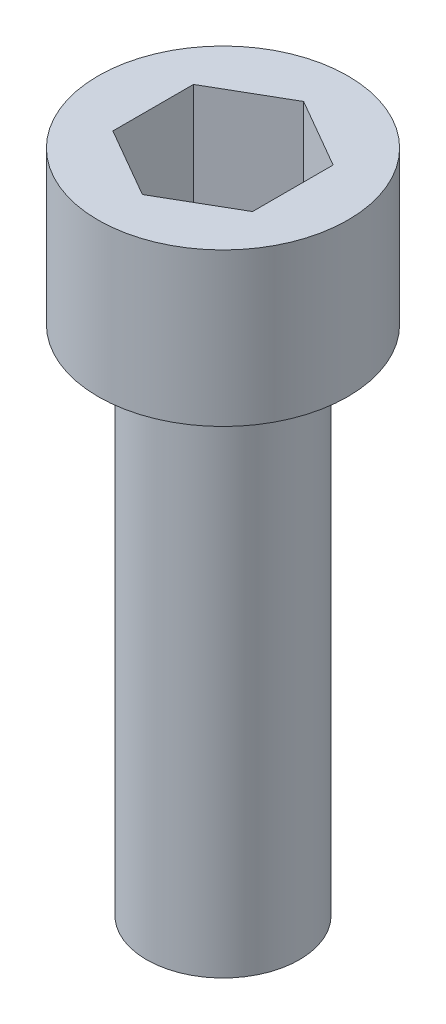
ISO-10303-21;
HEADER;
FILE_DESCRIPTION(('STEP AP214'),'2;1');
FILE_NAME('part.step','',(''),(''),'','','');
FILE_SCHEMA(('AUTOMOTIVE_DESIGN { 1 0 10303 214 1 1 1 1 }'));
ENDSEC;
DATA;
#1=APPLICATION_CONTEXT('core data for automotive mechanical design processes');
#2=APPLICATION_PROTOCOL_DEFINITION('international standard','automotive_design',2000,#1);
#3=PRODUCT_CONTEXT('',#1,'mechanical');
#4=PRODUCT('Part','Part','',(#3));
#5=PRODUCT_RELATED_PRODUCT_CATEGORY('part','',(#4));
#6=PRODUCT_DEFINITION_FORMATION('','',#4);
#7=PRODUCT_DEFINITION_CONTEXT('part definition',#1,'design');
#8=PRODUCT_DEFINITION('design','',#6,#7);
#9=PRODUCT_DEFINITION_SHAPE('','',#8);
#10=(LENGTH_UNIT() NAMED_UNIT(*) SI_UNIT(.MILLI.,.METRE.));
#11=(NAMED_UNIT(*) PLANE_ANGLE_UNIT() SI_UNIT($,.RADIAN.));
#12=(NAMED_UNIT(*) SI_UNIT($,.STERADIAN.) SOLID_ANGLE_UNIT());
#13=UNCERTAINTY_MEASURE_WITH_UNIT(LENGTH_MEASURE(1.E-05),#10,'distance_accuracy_value','');
#14=(GEOMETRIC_REPRESENTATION_CONTEXT(3) GLOBAL_UNCERTAINTY_ASSIGNED_CONTEXT((#13)) GLOBAL_UNIT_ASSIGNED_CONTEXT((#10,
#11,#12)) REPRESENTATION_CONTEXT('',''));
#15=CARTESIAN_POINT('',(0.,0.,0.));
#16=DIRECTION('',(0.,0.,1.));
#17=DIRECTION('',(1.,0.,0.));
#18=AXIS2_PLACEMENT_3D('',#15,#16,#17);
#19=CARTESIAN_POINT('',(0.,2.8448,0.));
#20=DIRECTION('',(0.,-1.,0.));
#21=DIRECTION('',(0.,0.,-1.));
#22=AXIS2_PLACEMENT_3D('',#19,#20,#21);
#23=CYLINDRICAL_SURFACE('',#22,2.3241);
#24=CARTESIAN_POINT('',(0.,2.8448,0.));
#25=DIRECTION('',(0.,1.,0.));
#26=DIRECTION('',(0.,0.,1.));
#27=AXIS2_PLACEMENT_3D('',#24,#25,#26);
#28=CIRCLE('',#27,2.3241);
#29=CARTESIAN_POINT('',(0.,2.8448,2.3241));
#30=VERTEX_POINT('',#29);
#31=EDGE_CURVE('E45',#30,#30,#28,.T.);
#32=ORIENTED_EDGE('',*,*,#31,.F.);
#33=EDGE_LOOP('',(#32));
#34=FACE_BOUND('',#33,.T.);
#35=CARTESIAN_POINT('',(0.,0.,0.));
#36=DIRECTION('',(0.,1.,0.));
#37=DIRECTION('',(0.,0.,1.));
#38=AXIS2_PLACEMENT_3D('',#35,#36,#37);
#39=CIRCLE('',#38,2.3241);
#40=CARTESIAN_POINT('',(0.,0.,2.3241));
#41=VERTEX_POINT('',#40);
#42=EDGE_CURVE('E40',#41,#41,#39,.T.);
#43=ORIENTED_EDGE('',*,*,#42,.T.);
#44=EDGE_LOOP('',(#43));
#45=FACE_BOUND('',#44,.T.);
#46=ADVANCED_FACE('F37',(#34,#45),#23,.T.);
#47=CARTESIAN_POINT('',(0.,2.8448,0.));
#48=DIRECTION('',(0.,1.,0.));
#49=DIRECTION('',(0.,0.,1.));
#50=AXIS2_PLACEMENT_3D('',#47,#48,#49);
#51=PLANE('',#50);
#52=DIRECTION('',(-0.866025403784439,0.,0.5));
#53=VECTOR('',#52,1.);
#54=CARTESIAN_POINT('',(0.,2.8448,-1.5));
#55=LINE('',#54,#53);
#56=CARTESIAN_POINT('',(0.,2.8448,-1.5));
#57=VERTEX_POINT('',#56);
#58=CARTESIAN_POINT('',(-1.29903810567666,2.8448,-0.750000000000012));
#59=VERTEX_POINT('',#58);
#60=EDGE_CURVE('E53',#57,#59,#55,.T.);
#61=ORIENTED_EDGE('',*,*,#60,.F.);
#62=DIRECTION('',(-0.866025403784448,0.,-0.499999999999984));
#63=VECTOR('',#62,1.);
#64=CARTESIAN_POINT('',(1.29903810567664,2.8448,-0.750000000000024));
#65=LINE('',#64,#63);
#66=CARTESIAN_POINT('',(1.29903810567664,2.8448,-0.750000000000024));
#67=VERTEX_POINT('',#66);
#68=EDGE_CURVE('E137',#67,#57,#65,.T.);
#69=ORIENTED_EDGE('',*,*,#68,.F.);
#70=DIRECTION('',(0.,0.,-1.));
#71=VECTOR('',#70,1.);
#72=CARTESIAN_POINT('',(1.29903810567667,2.8448,0.749999999999976));
#73=LINE('',#72,#71);
#74=CARTESIAN_POINT('',(1.29903810567667,2.8448,0.749999999999976));
#75=VERTEX_POINT('',#74);
#76=EDGE_CURVE('E135',#75,#67,#73,.T.);
#77=ORIENTED_EDGE('',*,*,#76,.F.);
#78=DIRECTION('',(0.866025403784439,0.,-0.5));
#79=VECTOR('',#78,1.);
#80=CARTESIAN_POINT('',(0.,2.8448,1.49999999999999));
#81=LINE('',#80,#79);
#82=CARTESIAN_POINT('',(0.,2.8448,1.49999999999999));
#83=VERTEX_POINT('',#82);
#84=EDGE_CURVE('E101',#83,#75,#81,.T.);
#85=ORIENTED_EDGE('',*,*,#84,.F.);
#86=DIRECTION('',(0.866025403784439,0.,0.5));
#87=VECTOR('',#86,1.);
#88=CARTESIAN_POINT('',(-1.29903810567666,2.8448,0.749999999999988));
#89=LINE('',#88,#87);
#90=CARTESIAN_POINT('',(-1.29903810567666,2.8448,0.749999999999988));
#91=VERTEX_POINT('',#90);
#92=EDGE_CURVE('E131',#91,#83,#89,.T.);
#93=ORIENTED_EDGE('',*,*,#92,.F.);
#94=DIRECTION('',(0.,0.,1.));
#95=VECTOR('',#94,1.);
#96=CARTESIAN_POINT('',(-1.29903810567666,2.8448,-0.750000000000012));
#97=LINE('',#96,#95);
#98=EDGE_CURVE('E127',#59,#91,#97,.T.);
#99=ORIENTED_EDGE('',*,*,#98,.F.);
#100=EDGE_LOOP('',(#61,#69,#77,#85,#93,#99));
#101=FACE_BOUND('',#100,.T.);
#102=ORIENTED_EDGE('',*,*,#31,.T.);
#103=EDGE_LOOP('',(#102));
#104=FACE_BOUND('',#103,.T.);
#105=ADVANCED_FACE('F155',(#101,#104),#51,.T.);
#106=CARTESIAN_POINT('',(0.,0.,0.));
#107=DIRECTION('',(0.,1.,0.));
#108=DIRECTION('',(0.,0.,1.));
#109=AXIS2_PLACEMENT_3D('',#106,#107,#108);
#110=PLANE('',#109);
#111=CARTESIAN_POINT('',(0.,0.,0.));
#112=DIRECTION('',(0.,-1.,0.));
#113=DIRECTION('',(0.,0.,-1.));
#114=AXIS2_PLACEMENT_3D('',#111,#112,#113);
#115=CIRCLE('',#114,1.4224);
#116=CARTESIAN_POINT('',(0.,0.,1.4224));
#117=VERTEX_POINT('',#116);
#118=EDGE_CURVE('E11',#117,#117,#115,.T.);
#119=ORIENTED_EDGE('',*,*,#118,.F.);
#120=EDGE_LOOP('',(#119));
#121=FACE_BOUND('',#120,.T.);
#122=ORIENTED_EDGE('',*,*,#42,.F.);
#123=EDGE_LOOP('',(#122));
#124=FACE_BOUND('',#123,.T.);
#125=ADVANCED_FACE('F152',(#121,#124),#110,.F.);
#126=CARTESIAN_POINT('',(0.,0.8448,-1.5));
#127=DIRECTION('',(-0.5,0.,-0.866025403784439));
#128=DIRECTION('',(-0.866025403784439,0.,0.5));
#129=AXIS2_PLACEMENT_3D('',#126,#127,#128);
#130=PLANE('',#129);
#131=ORIENTED_EDGE('',*,*,#60,.T.);
#132=DIRECTION('',(0.,1.,0.));
#133=VECTOR('',#132,1.);
#134=CARTESIAN_POINT('',(-1.29903810567666,0.8448,-0.750000000000012));
#135=LINE('',#134,#133);
#136=CARTESIAN_POINT('',(-1.29903810567666,0.8448,-0.750000000000012));
#137=VERTEX_POINT('',#136);
#138=EDGE_CURVE('E83',#137,#59,#135,.T.);
#139=ORIENTED_EDGE('',*,*,#138,.F.);
#140=DIRECTION('',(-0.866025403784439,0.,0.5));
#141=VECTOR('',#140,1.);
#142=CARTESIAN_POINT('',(0.,0.8448,-1.5));
#143=LINE('',#142,#141);
#144=CARTESIAN_POINT('',(0.,0.8448,-1.5));
#145=VERTEX_POINT('',#144);
#146=EDGE_CURVE('E139',#145,#137,#143,.T.);
#147=ORIENTED_EDGE('',*,*,#146,.F.);
#148=DIRECTION('',(0.,1.,0.));
#149=VECTOR('',#148,1.);
#150=CARTESIAN_POINT('',(0.,0.8448,-1.5));
#151=LINE('',#150,#149);
#152=EDGE_CURVE('E61',#145,#57,#151,.T.);
#153=ORIENTED_EDGE('',*,*,#152,.T.);
#154=EDGE_LOOP('',(#131,#139,#147,#153));
#155=FACE_BOUND('',#154,.T.);
#156=ADVANCED_FACE('F154',(#155),#130,.F.);
#157=CARTESIAN_POINT('',(1.29903810567664,0.8448,-0.750000000000024));
#158=DIRECTION('',(0.499999999999984,0.,-0.866025403784448));
#159=DIRECTION('',(-0.866025403784448,0.,-0.499999999999984));
#160=AXIS2_PLACEMENT_3D('',#157,#158,#159);
#161=PLANE('',#160);
#162=ORIENTED_EDGE('',*,*,#68,.T.);
#163=ORIENTED_EDGE('',*,*,#152,.F.);
#164=DIRECTION('',(-0.866025403784448,0.,-0.499999999999984));
#165=VECTOR('',#164,1.);
#166=CARTESIAN_POINT('',(1.29903810567664,0.8448,-0.750000000000024));
#167=LINE('',#166,#165);
#168=CARTESIAN_POINT('',(1.29903810567664,0.8448,-0.750000000000024));
#169=VERTEX_POINT('',#168);
#170=EDGE_CURVE('E113',#169,#145,#167,.T.);
#171=ORIENTED_EDGE('',*,*,#170,.F.);
#172=DIRECTION('',(0.,1.,0.));
#173=VECTOR('',#172,1.);
#174=CARTESIAN_POINT('',(1.29903810567664,0.8448,-0.750000000000024));
#175=LINE('',#174,#173);
#176=EDGE_CURVE('E105',#169,#67,#175,.T.);
#177=ORIENTED_EDGE('',*,*,#176,.T.);
#178=EDGE_LOOP('',(#162,#163,#171,#177));
#179=FACE_BOUND('',#178,.T.);
#180=ADVANCED_FACE('F161',(#179),#161,.F.);
#181=CARTESIAN_POINT('',(1.29903810567667,0.8448,0.749999999999976));
#182=DIRECTION('',(1.,0.,0.));
#183=DIRECTION('',(0.,0.,-1.));
#184=AXIS2_PLACEMENT_3D('',#181,#182,#183);
#185=PLANE('',#184);
#186=ORIENTED_EDGE('',*,*,#76,.T.);
#187=ORIENTED_EDGE('',*,*,#176,.F.);
#188=DIRECTION('',(0.,0.,-1.));
#189=VECTOR('',#188,1.);
#190=CARTESIAN_POINT('',(1.29903810567667,0.8448,0.749999999999976));
#191=LINE('',#190,#189);
#192=CARTESIAN_POINT('',(1.29903810567667,0.8448,0.749999999999976));
#193=VERTEX_POINT('',#192);
#194=EDGE_CURVE('E109',#193,#169,#191,.T.);
#195=ORIENTED_EDGE('',*,*,#194,.F.);
#196=DIRECTION('',(0.,1.,0.));
#197=VECTOR('',#196,1.);
#198=CARTESIAN_POINT('',(1.29903810567667,0.8448,0.749999999999976));
#199=LINE('',#198,#197);
#200=EDGE_CURVE('E94',#193,#75,#199,.T.);
#201=ORIENTED_EDGE('',*,*,#200,.T.);
#202=EDGE_LOOP('',(#186,#187,#195,#201));
#203=FACE_BOUND('',#202,.T.);
#204=ADVANCED_FACE('F110',(#203),#185,.F.);
#205=CARTESIAN_POINT('',(0.,0.8448,1.49999999999999));
#206=DIRECTION('',(0.5,0.,0.866025403784439));
#207=DIRECTION('',(0.866025403784439,0.,-0.5));
#208=AXIS2_PLACEMENT_3D('',#205,#206,#207);
#209=PLANE('',#208);
#210=ORIENTED_EDGE('',*,*,#84,.T.);
#211=ORIENTED_EDGE('',*,*,#200,.F.);
#212=DIRECTION('',(0.866025403784439,0.,-0.5));
#213=VECTOR('',#212,1.);
#214=CARTESIAN_POINT('',(0.,0.8448,1.49999999999999));
#215=LINE('',#214,#213);
#216=CARTESIAN_POINT('',(0.,0.8448,1.49999999999999));
#217=VERTEX_POINT('',#216);
#218=EDGE_CURVE('E98',#217,#193,#215,.T.);
#219=ORIENTED_EDGE('',*,*,#218,.F.);
#220=DIRECTION('',(0.,1.,0.));
#221=VECTOR('',#220,1.);
#222=CARTESIAN_POINT('',(0.,0.8448,1.49999999999999));
#223=LINE('',#222,#221);
#224=EDGE_CURVE('E106',#217,#83,#223,.T.);
#225=ORIENTED_EDGE('',*,*,#224,.T.);
#226=EDGE_LOOP('',(#210,#211,#219,#225));
#227=FACE_BOUND('',#226,.T.);
#228=ADVANCED_FACE('F96',(#227),#209,.F.);
#229=CARTESIAN_POINT('',(-1.29903810567666,0.8448,0.749999999999988));
#230=DIRECTION('',(-0.5,0.,0.866025403784439));
#231=DIRECTION('',(0.866025403784439,0.,0.5));
#232=AXIS2_PLACEMENT_3D('',#229,#230,#231);
#233=PLANE('',#232);
#234=ORIENTED_EDGE('',*,*,#92,.T.);
#235=ORIENTED_EDGE('',*,*,#224,.F.);
#236=DIRECTION('',(0.866025403784439,0.,0.5));
#237=VECTOR('',#236,1.);
#238=CARTESIAN_POINT('',(-1.29903810567666,0.8448,0.749999999999988));
#239=LINE('',#238,#237);
#240=CARTESIAN_POINT('',(-1.29903810567666,0.8448,0.749999999999988));
#241=VERTEX_POINT('',#240);
#242=EDGE_CURVE('E119',#241,#217,#239,.T.);
#243=ORIENTED_EDGE('',*,*,#242,.F.);
#244=DIRECTION('',(0.,1.,0.));
#245=VECTOR('',#244,1.);
#246=CARTESIAN_POINT('',(-1.29903810567666,0.8448,0.749999999999988));
#247=LINE('',#246,#245);
#248=EDGE_CURVE('E143',#241,#91,#247,.T.);
#249=ORIENTED_EDGE('',*,*,#248,.T.);
#250=EDGE_LOOP('',(#234,#235,#243,#249));
#251=FACE_BOUND('',#250,.T.);
#252=ADVANCED_FACE('F206',(#251),#233,.F.);
#253=CARTESIAN_POINT('',(-1.29903810567666,0.8448,-0.750000000000012));
#254=DIRECTION('',(-1.,0.,0.));
#255=DIRECTION('',(0.,0.,1.));
#256=AXIS2_PLACEMENT_3D('',#253,#254,#255);
#257=PLANE('',#256);
#258=ORIENTED_EDGE('',*,*,#98,.T.);
#259=ORIENTED_EDGE('',*,*,#248,.F.);
#260=DIRECTION('',(0.,0.,1.));
#261=VECTOR('',#260,1.);
#262=CARTESIAN_POINT('',(-1.29903810567666,0.8448,-0.750000000000012));
#263=LINE('',#262,#261);
#264=EDGE_CURVE('E121',#137,#241,#263,.T.);
#265=ORIENTED_EDGE('',*,*,#264,.F.);
#266=ORIENTED_EDGE('',*,*,#138,.T.);
#267=EDGE_LOOP('',(#258,#259,#265,#266));
#268=FACE_BOUND('',#267,.T.);
#269=ADVANCED_FACE('F215',(#268),#257,.F.);
#270=CARTESIAN_POINT('',(0.,0.8448,0.));
#271=DIRECTION('',(0.,1.,0.));
#272=DIRECTION('',(0.,0.,1.));
#273=AXIS2_PLACEMENT_3D('',#270,#271,#272);
#274=PLANE('',#273);
#275=ORIENTED_EDGE('',*,*,#146,.T.);
#276=ORIENTED_EDGE('',*,*,#264,.T.);
#277=ORIENTED_EDGE('',*,*,#242,.T.);
#278=ORIENTED_EDGE('',*,*,#218,.T.);
#279=ORIENTED_EDGE('',*,*,#194,.T.);
#280=ORIENTED_EDGE('',*,*,#170,.T.);
#281=EDGE_LOOP('',(#275,#276,#277,#278,#279,#280));
#282=FACE_BOUND('',#281,.T.);
#283=ADVANCED_FACE('F116',(#282),#274,.T.);
#284=CARTESIAN_POINT('',(0.,-9.525,0.));
#285=DIRECTION('',(0.,1.,0.));
#286=DIRECTION('',(0.,0.,1.));
#287=AXIS2_PLACEMENT_3D('',#284,#285,#286);
#288=CYLINDRICAL_SURFACE('',#287,1.4224);
#289=CARTESIAN_POINT('',(0.,-9.525,0.));
#290=DIRECTION('',(0.,-1.,0.));
#291=DIRECTION('',(0.,0.,-1.));
#292=AXIS2_PLACEMENT_3D('',#289,#290,#291);
#293=CIRCLE('',#292,1.4224);
#294=CARTESIAN_POINT('',(0.,-9.525,1.4224));
#295=VERTEX_POINT('',#294);
#296=EDGE_CURVE('E128',#295,#295,#293,.T.);
#297=CARTESIAN_POINT('',(0.,-9.525,1.4224));
#298=CARTESIAN_POINT('',(0.,-9.42578125,1.4224));
#299=CARTESIAN_POINT('',(0.,-9.3265625,1.4224));
#300=CARTESIAN_POINT('',(0.,-9.128125,1.4224));
#301=CARTESIAN_POINT('',(0.,-9.02890625,1.4224));
#302=CARTESIAN_POINT('',(0.,-8.83046875,1.4224));
#303=CARTESIAN_POINT('',(0.,-8.73125,1.4224));
#304=CARTESIAN_POINT('',(0.,-8.5328125,1.4224));
#305=CARTESIAN_POINT('',(0.,-8.43359375,1.4224));
#306=CARTESIAN_POINT('',(0.,-8.23515625,1.4224));
#307=CARTESIAN_POINT('',(0.,-8.1359375,1.4224));
#308=CARTESIAN_POINT('',(0.,-7.9375,1.4224));
#309=CARTESIAN_POINT('',(0.,-7.83828125,1.4224));
#310=CARTESIAN_POINT('',(0.,-7.63984375,1.4224));
#311=CARTESIAN_POINT('',(0.,-7.540625,1.4224));
#312=CARTESIAN_POINT('',(0.,-7.3421875,1.4224));
#313=CARTESIAN_POINT('',(0.,-7.24296875,1.4224));
#314=CARTESIAN_POINT('',(0.,-7.04453125,1.4224));
#315=CARTESIAN_POINT('',(0.,-6.9453125,1.4224));
#316=CARTESIAN_POINT('',(0.,-6.746875,1.4224));
#317=CARTESIAN_POINT('',(0.,-6.64765625,1.4224));
#318=CARTESIAN_POINT('',(0.,-6.44921875,1.4224));
#319=CARTESIAN_POINT('',(0.,-6.35,1.4224));
#320=CARTESIAN_POINT('',(0.,-6.1515625,1.4224));
#321=CARTESIAN_POINT('',(0.,-6.05234375,1.4224));
#322=CARTESIAN_POINT('',(0.,-5.85390625,1.4224));
#323=CARTESIAN_POINT('',(0.,-5.7546875,1.4224));
#324=CARTESIAN_POINT('',(0.,-5.55625,1.4224));
#325=CARTESIAN_POINT('',(0.,-5.45703125,1.4224));
#326=CARTESIAN_POINT('',(0.,-5.25859375,1.4224));
#327=CARTESIAN_POINT('',(0.,-5.159375,1.4224));
#328=CARTESIAN_POINT('',(0.,-4.9609375,1.4224));
#329=CARTESIAN_POINT('',(0.,-4.86171875,1.4224));
#330=CARTESIAN_POINT('',(0.,-4.66328125,1.4224));
#331=CARTESIAN_POINT('',(0.,-4.5640625,1.4224));
#332=CARTESIAN_POINT('',(0.,-4.365625,1.4224));
#333=CARTESIAN_POINT('',(0.,-4.26640625,1.4224));
#334=CARTESIAN_POINT('',(0.,-4.06796875,1.4224));
#335=CARTESIAN_POINT('',(0.,-3.96875,1.4224));
#336=CARTESIAN_POINT('',(0.,-3.7703125,1.4224));
#337=CARTESIAN_POINT('',(0.,-3.67109375,1.4224));
#338=CARTESIAN_POINT('',(0.,-3.47265625,1.4224));
#339=CARTESIAN_POINT('',(0.,-3.3734375,1.4224));
#340=CARTESIAN_POINT('',(0.,-3.175,1.4224));
#341=CARTESIAN_POINT('',(0.,-3.07578125,1.4224));
#342=CARTESIAN_POINT('',(0.,-2.87734375,1.4224));
#343=CARTESIAN_POINT('',(0.,-2.778125,1.4224));
#344=CARTESIAN_POINT('',(0.,-2.5796875,1.4224));
#345=CARTESIAN_POINT('',(0.,-2.48046875,1.4224));
#346=CARTESIAN_POINT('',(0.,-2.28203125,1.4224));
#347=CARTESIAN_POINT('',(0.,-2.1828125,1.4224));
#348=CARTESIAN_POINT('',(0.,-1.984375,1.4224));
#349=CARTESIAN_POINT('',(0.,-1.88515625,1.4224));
#350=CARTESIAN_POINT('',(0.,-1.68671875,1.4224));
#351=CARTESIAN_POINT('',(0.,-1.5875,1.4224));
#352=CARTESIAN_POINT('',(0.,-1.3890625,1.4224));
#353=CARTESIAN_POINT('',(0.,-1.28984375,1.4224));
#354=CARTESIAN_POINT('',(0.,-1.09140625,1.4224));
#355=CARTESIAN_POINT('',(0.,-0.992187500000001,1.4224));
#356=CARTESIAN_POINT('',(0.,-0.793750000000001,1.4224));
#357=CARTESIAN_POINT('',(0.,-0.69453125,1.4224));
#358=CARTESIAN_POINT('',(0.,-0.49609375,1.4224));
#359=CARTESIAN_POINT('',(0.,-0.396875,1.4224));
#360=CARTESIAN_POINT('',(0.,-0.1984375,1.4224));
#361=CARTESIAN_POINT('',(0.,-0.0992187500000001,1.4224));
#362=CARTESIAN_POINT('',(0.,0.,1.4224));
#363=B_SPLINE_CURVE_WITH_KNOTS('',3,(#297,#298,#299,#300,#301,#302,#303,#304,#305,#306,#307,
#308,#309,#310,#311,#312,#313,#314,#315,#316,#317,#318,#319,#320,#321,#322,#323,#324,#325,#326,
#327,#328,#329,#330,#331,#332,#333,#334,#335,#336,#337,#338,#339,#340,#341,#342,#343,#344,#345,
#346,#347,#348,#349,#350,#351,#352,#353,#354,#355,#356,#357,#358,#359,#360,#361,#362),
.UNSPECIFIED.,.F.,.F.,(4,2,2,2,2,2,2,2,2,2,2,2,2,2,2,2,2,2,2,2,2,2,2,2,2,2,2,2,2,2,2,2,4),(0.,
0.297656249999998,0.595312499999999,0.892968749999999,1.190625,1.48828125,1.7859375,2.08359375,
2.38125,2.67890625,2.9765625,3.27421875,3.571875,3.86953125,4.1671875,4.46484375,4.7625,
5.06015625,5.3578125,5.65546875,5.953125,6.25078125,6.5484375,6.84609375,7.14375,7.44140625,
7.7390625,8.03671875,8.334375,8.63203125,8.9296875,9.22734375,9.525),.UNSPECIFIED.);
#364=EDGE_CURVE('BSEAM233',#295,#117,#363,.T.);
#365=ORIENTED_EDGE('',*,*,#296,.F.);
#366=ORIENTED_EDGE('',*,*,#118,.T.);
#367=ORIENTED_EDGE('',*,*,#364,.T.);
#368=ORIENTED_EDGE('',*,*,#364,.F.);
#369=EDGE_LOOP('',(#365,#367,#366,#368));
#370=FACE_BOUND('',#369,.T.);
#371=ADVANCED_FACE('F233',(#370),#288,.T.);
#372=CARTESIAN_POINT('',(0.,-9.525,0.));
#373=DIRECTION('',(0.,-1.,0.));
#374=DIRECTION('',(0.,0.,-1.));
#375=AXIS2_PLACEMENT_3D('',#372,#373,#374);
#376=PLANE('',#375);
#377=ORIENTED_EDGE('',*,*,#296,.T.);
#378=EDGE_LOOP('',(#377));
#379=FACE_BOUND('',#378,.T.);
#380=ADVANCED_FACE('F246',(#379),#376,.T.);
#381=CLOSED_SHELL('',(#46,#105,#125,#156,#180,#204,#228,#252,#269,#283,#371,#380));
#382=MANIFOLD_SOLID_BREP('B2',#381);
#383=ADVANCED_BREP_SHAPE_REPRESENTATION('',(#18,#382),#14);
#384=SHAPE_DEFINITION_REPRESENTATION(#9,#383);
ENDSEC;
END-ISO-10303-21;
